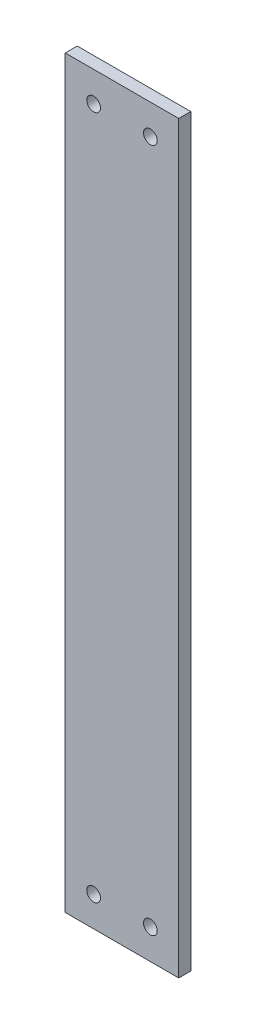
ISO-10303-21;
HEADER;
FILE_DESCRIPTION(('STEP AP214'),'2;1');
FILE_NAME('part.step','',(''),(''),'','','');
FILE_SCHEMA(('AUTOMOTIVE_DESIGN { 1 0 10303 214 1 1 1 1 }'));
ENDSEC;
DATA;
#1=APPLICATION_CONTEXT('core data for automotive mechanical design processes');
#2=APPLICATION_PROTOCOL_DEFINITION('international standard','automotive_design',2000,#1);
#3=PRODUCT_CONTEXT('',#1,'mechanical');
#4=PRODUCT('Part','Part','',(#3));
#5=PRODUCT_RELATED_PRODUCT_CATEGORY('part','',(#4));
#6=PRODUCT_DEFINITION_FORMATION('','',#4);
#7=PRODUCT_DEFINITION_CONTEXT('part definition',#1,'design');
#8=PRODUCT_DEFINITION('design','',#6,#7);
#9=PRODUCT_DEFINITION_SHAPE('','',#8);
#10=(LENGTH_UNIT() NAMED_UNIT(*) SI_UNIT(.MILLI.,.METRE.));
#11=(NAMED_UNIT(*) PLANE_ANGLE_UNIT() SI_UNIT($,.RADIAN.));
#12=(NAMED_UNIT(*) SI_UNIT($,.STERADIAN.) SOLID_ANGLE_UNIT());
#13=UNCERTAINTY_MEASURE_WITH_UNIT(LENGTH_MEASURE(1.E-05),#10,'distance_accuracy_value','');
#14=(GEOMETRIC_REPRESENTATION_CONTEXT(3) GLOBAL_UNCERTAINTY_ASSIGNED_CONTEXT((#13)) GLOBAL_UNIT_ASSIGNED_CONTEXT((#10,
#11,#12)) REPRESENTATION_CONTEXT('',''));
#15=CARTESIAN_POINT('',(0.,0.,0.));
#16=DIRECTION('',(0.,0.,1.));
#17=DIRECTION('',(1.,0.,0.));
#18=AXIS2_PLACEMENT_3D('',#15,#16,#17);
#19=CARTESIAN_POINT('',(0.,0.,3.6));
#20=DIRECTION('',(0.,0.,1.));
#21=DIRECTION('',(1.,0.,0.));
#22=AXIS2_PLACEMENT_3D('',#19,#20,#21);
#23=PLANE('',#22);
#24=CARTESIAN_POINT('',(8.50000000000005,-102.5,3.6));
#25=DIRECTION('',(0.,0.,1.));
#26=DIRECTION('',(1.,0.,0.));
#27=AXIS2_PLACEMENT_3D('',#24,#25,#26);
#28=CIRCLE('',#27,2.05);
#29=CARTESIAN_POINT('',(10.55,-102.5,3.6));
#30=VERTEX_POINT('',#29);
#31=EDGE_CURVE('E123',#30,#30,#28,.T.);
#32=ORIENTED_EDGE('',*,*,#31,.F.);
#33=EDGE_LOOP('',(#32));
#34=FACE_BOUND('',#33,.T.);
#35=CARTESIAN_POINT('',(-8.50000000000001,102.5,3.6));
#36=DIRECTION('',(0.,0.,1.));
#37=DIRECTION('',(1.,0.,0.));
#38=AXIS2_PLACEMENT_3D('',#35,#36,#37);
#39=CIRCLE('',#38,2.05);
#40=CARTESIAN_POINT('',(-6.45000000000001,102.5,3.6));
#41=VERTEX_POINT('',#40);
#42=EDGE_CURVE('E102',#41,#41,#39,.T.);
#43=ORIENTED_EDGE('',*,*,#42,.F.);
#44=EDGE_LOOP('',(#43));
#45=FACE_BOUND('',#44,.T.);
#46=DIRECTION('',(0.,-1.,0.));
#47=VECTOR('',#46,1.);
#48=CARTESIAN_POINT('',(-17.,-111.5,3.6));
#49=LINE('',#48,#47);
#50=CARTESIAN_POINT('',(-17.,111.5,3.6));
#51=VERTEX_POINT('',#50);
#52=CARTESIAN_POINT('',(-17.,-111.5,3.6));
#53=VERTEX_POINT('',#52);
#54=EDGE_CURVE('E87',#51,#53,#49,.T.);
#55=ORIENTED_EDGE('',*,*,#54,.T.);
#56=DIRECTION('',(1.,0.,0.));
#57=VECTOR('',#56,1.);
#58=CARTESIAN_POINT('',(17.,-111.5,3.6));
#59=LINE('',#58,#57);
#60=CARTESIAN_POINT('',(17.,-111.5,3.6));
#61=VERTEX_POINT('',#60);
#62=EDGE_CURVE('E82',#53,#61,#59,.T.);
#63=ORIENTED_EDGE('',*,*,#62,.T.);
#64=DIRECTION('',(0.,1.,0.));
#65=VECTOR('',#64,1.);
#66=CARTESIAN_POINT('',(17.,-111.5,3.6));
#67=LINE('',#66,#65);
#68=CARTESIAN_POINT('',(17.,111.5,3.6));
#69=VERTEX_POINT('',#68);
#70=EDGE_CURVE('E85',#61,#69,#67,.T.);
#71=ORIENTED_EDGE('',*,*,#70,.T.);
#72=DIRECTION('',(-1.,0.,0.));
#73=VECTOR('',#72,1.);
#74=CARTESIAN_POINT('',(17.,111.5,3.6));
#75=LINE('',#74,#73);
#76=EDGE_CURVE('E52',#69,#51,#75,.T.);
#77=ORIENTED_EDGE('',*,*,#76,.T.);
#78=EDGE_LOOP('',(#55,#63,#71,#77));
#79=FACE_BOUND('',#78,.T.);
#80=CARTESIAN_POINT('',(-8.50000000000001,-102.5,3.6));
#81=DIRECTION('',(0.,0.,1.));
#82=DIRECTION('',(-1.,0.,0.));
#83=AXIS2_PLACEMENT_3D('',#80,#81,#82);
#84=CIRCLE('',#83,2.05);
#85=CARTESIAN_POINT('',(-10.55,-102.5,3.6));
#86=VERTEX_POINT('',#85);
#87=EDGE_CURVE('E117',#86,#86,#84,.T.);
#88=ORIENTED_EDGE('',*,*,#87,.F.);
#89=EDGE_LOOP('',(#88));
#90=FACE_BOUND('',#89,.T.);
#91=CARTESIAN_POINT('',(8.49999999999999,102.5,3.6));
#92=DIRECTION('',(0.,0.,1.));
#93=DIRECTION('',(-1.,0.,0.));
#94=AXIS2_PLACEMENT_3D('',#91,#92,#93);
#95=CIRCLE('',#94,2.05);
#96=CARTESIAN_POINT('',(6.45,102.5,3.6));
#97=VERTEX_POINT('',#96);
#98=EDGE_CURVE('E129',#97,#97,#95,.T.);
#99=ORIENTED_EDGE('',*,*,#98,.F.);
#100=EDGE_LOOP('',(#99));
#101=FACE_BOUND('',#100,.T.);
#102=ADVANCED_FACE('F35',(#34,#45,#79,#90,#101),#23,.T.);
#103=CARTESIAN_POINT('',(0.,0.,0.));
#104=DIRECTION('',(0.,0.,1.));
#105=DIRECTION('',(1.,0.,0.));
#106=AXIS2_PLACEMENT_3D('',#103,#104,#105);
#107=PLANE('',#106);
#108=DIRECTION('',(0.,-1.,0.));
#109=VECTOR('',#108,1.);
#110=CARTESIAN_POINT('',(-17.,-111.5,0.));
#111=LINE('',#110,#109);
#112=CARTESIAN_POINT('',(-17.,111.5,0.));
#113=VERTEX_POINT('',#112);
#114=CARTESIAN_POINT('',(-17.,-111.5,0.));
#115=VERTEX_POINT('',#114);
#116=EDGE_CURVE('E99',#113,#115,#111,.T.);
#117=ORIENTED_EDGE('',*,*,#116,.F.);
#118=DIRECTION('',(-1.,0.,0.));
#119=VECTOR('',#118,1.);
#120=CARTESIAN_POINT('',(17.,111.5,0.));
#121=LINE('',#120,#119);
#122=CARTESIAN_POINT('',(17.,111.5,0.));
#123=VERTEX_POINT('',#122);
#124=EDGE_CURVE('E75',#123,#113,#121,.T.);
#125=ORIENTED_EDGE('',*,*,#124,.F.);
#126=DIRECTION('',(0.,1.,0.));
#127=VECTOR('',#126,1.);
#128=CARTESIAN_POINT('',(17.,-111.5,0.));
#129=LINE('',#128,#127);
#130=CARTESIAN_POINT('',(17.,-111.5,0.));
#131=VERTEX_POINT('',#130);
#132=EDGE_CURVE('E69',#131,#123,#129,.T.);
#133=ORIENTED_EDGE('',*,*,#132,.F.);
#134=DIRECTION('',(1.,0.,0.));
#135=VECTOR('',#134,1.);
#136=CARTESIAN_POINT('',(17.,-111.5,0.));
#137=LINE('',#136,#135);
#138=EDGE_CURVE('E91',#115,#131,#137,.T.);
#139=ORIENTED_EDGE('',*,*,#138,.F.);
#140=EDGE_LOOP('',(#117,#125,#133,#139));
#141=FACE_BOUND('',#140,.T.);
#142=CARTESIAN_POINT('',(-8.50000000000001,102.5,0.));
#143=DIRECTION('',(0.,0.,1.));
#144=DIRECTION('',(1.,0.,0.));
#145=AXIS2_PLACEMENT_3D('',#142,#143,#144);
#146=CIRCLE('',#145,2.05);
#147=CARTESIAN_POINT('',(-6.45000000000001,102.5,0.));
#148=VERTEX_POINT('',#147);
#149=EDGE_CURVE('E114',#148,#148,#146,.T.);
#150=ORIENTED_EDGE('',*,*,#149,.T.);
#151=EDGE_LOOP('',(#150));
#152=FACE_BOUND('',#151,.T.);
#153=CARTESIAN_POINT('',(-8.50000000000001,-102.5,0.));
#154=DIRECTION('',(0.,0.,1.));
#155=DIRECTION('',(-1.,0.,0.));
#156=AXIS2_PLACEMENT_3D('',#153,#154,#155);
#157=CIRCLE('',#156,2.05);
#158=CARTESIAN_POINT('',(-10.55,-102.5,0.));
#159=VERTEX_POINT('',#158);
#160=EDGE_CURVE('E120',#159,#159,#157,.T.);
#161=ORIENTED_EDGE('',*,*,#160,.T.);
#162=EDGE_LOOP('',(#161));
#163=FACE_BOUND('',#162,.T.);
#164=CARTESIAN_POINT('',(8.50000000000005,-102.5,0.));
#165=DIRECTION('',(0.,0.,1.));
#166=DIRECTION('',(1.,0.,0.));
#167=AXIS2_PLACEMENT_3D('',#164,#165,#166);
#168=CIRCLE('',#167,2.05);
#169=CARTESIAN_POINT('',(10.55,-102.5,0.));
#170=VERTEX_POINT('',#169);
#171=EDGE_CURVE('E126',#170,#170,#168,.T.);
#172=ORIENTED_EDGE('',*,*,#171,.T.);
#173=EDGE_LOOP('',(#172));
#174=FACE_BOUND('',#173,.T.);
#175=CARTESIAN_POINT('',(8.49999999999999,102.5,0.));
#176=DIRECTION('',(0.,0.,1.));
#177=DIRECTION('',(-1.,0.,0.));
#178=AXIS2_PLACEMENT_3D('',#175,#176,#177);
#179=CIRCLE('',#178,2.05);
#180=CARTESIAN_POINT('',(6.45,102.5,0.));
#181=VERTEX_POINT('',#180);
#182=EDGE_CURVE('E132',#181,#181,#179,.T.);
#183=ORIENTED_EDGE('',*,*,#182,.T.);
#184=EDGE_LOOP('',(#183));
#185=FACE_BOUND('',#184,.T.);
#186=ADVANCED_FACE('F110',(#141,#152,#163,#174,#185),#107,.F.);
#187=CARTESIAN_POINT('',(-17.,-111.5,3.6));
#188=DIRECTION('',(1.,0.,0.));
#189=DIRECTION('',(0.,0.,-1.));
#190=AXIS2_PLACEMENT_3D('',#187,#188,#189);
#191=PLANE('',#190);
#192=ORIENTED_EDGE('',*,*,#116,.T.);
#193=DIRECTION('',(0.,0.,-1.));
#194=VECTOR('',#193,1.);
#195=CARTESIAN_POINT('',(-17.,-111.5,3.6));
#196=LINE('',#195,#194);
#197=EDGE_CURVE('E11',#53,#115,#196,.T.);
#198=ORIENTED_EDGE('',*,*,#197,.F.);
#199=ORIENTED_EDGE('',*,*,#54,.F.);
#200=DIRECTION('',(0.,0.,-1.));
#201=VECTOR('',#200,1.);
#202=CARTESIAN_POINT('',(-17.,111.5,3.6));
#203=LINE('',#202,#201);
#204=EDGE_CURVE('E95',#51,#113,#203,.T.);
#205=ORIENTED_EDGE('',*,*,#204,.T.);
#206=EDGE_LOOP('',(#192,#198,#199,#205));
#207=FACE_BOUND('',#206,.T.);
#208=ADVANCED_FACE('F37',(#207),#191,.F.);
#209=CARTESIAN_POINT('',(17.,-111.5,3.6));
#210=DIRECTION('',(0.,1.,0.));
#211=DIRECTION('',(-1.,0.,0.));
#212=AXIS2_PLACEMENT_3D('',#209,#210,#211);
#213=PLANE('',#212);
#214=ORIENTED_EDGE('',*,*,#138,.T.);
#215=DIRECTION('',(0.,0.,-1.));
#216=VECTOR('',#215,1.);
#217=CARTESIAN_POINT('',(17.,-111.5,3.6));
#218=LINE('',#217,#216);
#219=EDGE_CURVE('E44',#61,#131,#218,.T.);
#220=ORIENTED_EDGE('',*,*,#219,.F.);
#221=ORIENTED_EDGE('',*,*,#62,.F.);
#222=ORIENTED_EDGE('',*,*,#197,.T.);
#223=EDGE_LOOP('',(#214,#220,#221,#222));
#224=FACE_BOUND('',#223,.T.);
#225=ADVANCED_FACE('F90',(#224),#213,.F.);
#226=CARTESIAN_POINT('',(17.,-111.5,3.6));
#227=DIRECTION('',(-1.,0.,0.));
#228=DIRECTION('',(0.,0.,1.));
#229=AXIS2_PLACEMENT_3D('',#226,#227,#228);
#230=PLANE('',#229);
#231=ORIENTED_EDGE('',*,*,#132,.T.);
#232=DIRECTION('',(0.,0.,-1.));
#233=VECTOR('',#232,1.);
#234=CARTESIAN_POINT('',(17.,111.5,3.6));
#235=LINE('',#234,#233);
#236=EDGE_CURVE('E92',#69,#123,#235,.T.);
#237=ORIENTED_EDGE('',*,*,#236,.F.);
#238=ORIENTED_EDGE('',*,*,#70,.F.);
#239=ORIENTED_EDGE('',*,*,#219,.T.);
#240=EDGE_LOOP('',(#231,#237,#238,#239));
#241=FACE_BOUND('',#240,.T.);
#242=ADVANCED_FACE('F93',(#241),#230,.F.);
#243=CARTESIAN_POINT('',(17.,111.5,3.6));
#244=DIRECTION('',(0.,-1.,0.));
#245=DIRECTION('',(0.,0.,-1.));
#246=AXIS2_PLACEMENT_3D('',#243,#244,#245);
#247=PLANE('',#246);
#248=ORIENTED_EDGE('',*,*,#124,.T.);
#249=ORIENTED_EDGE('',*,*,#204,.F.);
#250=ORIENTED_EDGE('',*,*,#76,.F.);
#251=ORIENTED_EDGE('',*,*,#236,.T.);
#252=EDGE_LOOP('',(#248,#249,#250,#251));
#253=FACE_BOUND('',#252,.T.);
#254=ADVANCED_FACE('F107',(#253),#247,.F.);
#255=CARTESIAN_POINT('',(-8.50000000000001,102.5,3.6));
#256=DIRECTION('',(0.,0.,-1.));
#257=DIRECTION('',(-1.,0.,0.));
#258=AXIS2_PLACEMENT_3D('',#255,#256,#257);
#259=CYLINDRICAL_SURFACE('',#258,2.05);
#260=ORIENTED_EDGE('',*,*,#42,.T.);
#261=EDGE_LOOP('',(#260));
#262=FACE_BOUND('',#261,.T.);
#263=ORIENTED_EDGE('',*,*,#149,.F.);
#264=EDGE_LOOP('',(#263));
#265=FACE_BOUND('',#264,.T.);
#266=ADVANCED_FACE('F151',(#262,#265),#259,.F.);
#267=CARTESIAN_POINT('',(-8.50000000000001,-102.5,3.6));
#268=DIRECTION('',(0.,0.,-1.));
#269=DIRECTION('',(-1.,0.,0.));
#270=AXIS2_PLACEMENT_3D('',#267,#268,#269);
#271=CYLINDRICAL_SURFACE('',#270,2.05);
#272=ORIENTED_EDGE('',*,*,#87,.T.);
#273=EDGE_LOOP('',(#272));
#274=FACE_BOUND('',#273,.T.);
#275=ORIENTED_EDGE('',*,*,#160,.F.);
#276=EDGE_LOOP('',(#275));
#277=FACE_BOUND('',#276,.T.);
#278=ADVANCED_FACE('F197',(#274,#277),#271,.F.);
#279=CARTESIAN_POINT('',(8.50000000000005,-102.5,3.6));
#280=DIRECTION('',(0.,0.,-1.));
#281=DIRECTION('',(-1.,0.,0.));
#282=AXIS2_PLACEMENT_3D('',#279,#280,#281);
#283=CYLINDRICAL_SURFACE('',#282,2.05);
#284=ORIENTED_EDGE('',*,*,#31,.T.);
#285=EDGE_LOOP('',(#284));
#286=FACE_BOUND('',#285,.T.);
#287=ORIENTED_EDGE('',*,*,#171,.F.);
#288=EDGE_LOOP('',(#287));
#289=FACE_BOUND('',#288,.T.);
#290=ADVANCED_FACE('F205',(#286,#289),#283,.F.);
#291=CARTESIAN_POINT('',(8.49999999999999,102.5,3.6));
#292=DIRECTION('',(0.,0.,-1.));
#293=DIRECTION('',(-1.,0.,0.));
#294=AXIS2_PLACEMENT_3D('',#291,#292,#293);
#295=CYLINDRICAL_SURFACE('',#294,2.05);
#296=ORIENTED_EDGE('',*,*,#98,.T.);
#297=EDGE_LOOP('',(#296));
#298=FACE_BOUND('',#297,.T.);
#299=ORIENTED_EDGE('',*,*,#182,.F.);
#300=EDGE_LOOP('',(#299));
#301=FACE_BOUND('',#300,.T.);
#302=ADVANCED_FACE('F138',(#298,#301),#295,.F.);
#303=CLOSED_SHELL('',(#102,#186,#208,#225,#242,#254,#266,#278,#290,#302));
#304=MANIFOLD_SOLID_BREP('B2',#303);
#305=ADVANCED_BREP_SHAPE_REPRESENTATION('',(#18,#304),#14);
#306=SHAPE_DEFINITION_REPRESENTATION(#9,#305);
ENDSEC;
END-ISO-10303-21;
